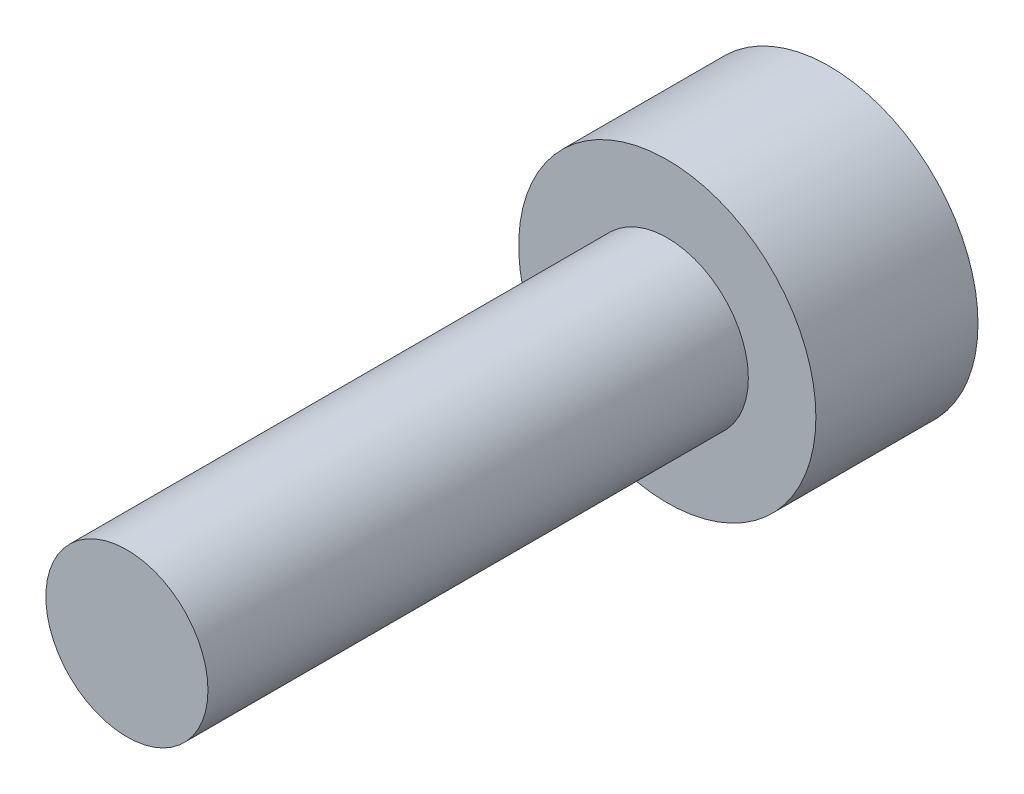
ISO-10303-21;
HEADER;
FILE_DESCRIPTION(('STEP AP214'),'2;1');
FILE_NAME('part.step','',(''),(''),'','','');
FILE_SCHEMA(('AUTOMOTIVE_DESIGN { 1 0 10303 214 1 1 1 1 }'));
ENDSEC;
DATA;
#1=APPLICATION_CONTEXT('core data for automotive mechanical design processes');
#2=APPLICATION_PROTOCOL_DEFINITION('international standard','automotive_design',2000,#1);
#3=PRODUCT_CONTEXT('',#1,'mechanical');
#4=PRODUCT('Part','Part','',(#3));
#5=PRODUCT_RELATED_PRODUCT_CATEGORY('part','',(#4));
#6=PRODUCT_DEFINITION_FORMATION('','',#4);
#7=PRODUCT_DEFINITION_CONTEXT('part definition',#1,'design');
#8=PRODUCT_DEFINITION('design','',#6,#7);
#9=PRODUCT_DEFINITION_SHAPE('','',#8);
#10=(LENGTH_UNIT() NAMED_UNIT(*) SI_UNIT(.MILLI.,.METRE.));
#11=(NAMED_UNIT(*) PLANE_ANGLE_UNIT() SI_UNIT($,.RADIAN.));
#12=(NAMED_UNIT(*) SI_UNIT($,.STERADIAN.) SOLID_ANGLE_UNIT());
#13=UNCERTAINTY_MEASURE_WITH_UNIT(LENGTH_MEASURE(1.E-05),#10,'distance_accuracy_value','');
#14=(GEOMETRIC_REPRESENTATION_CONTEXT(3) GLOBAL_UNCERTAINTY_ASSIGNED_CONTEXT((#13)) GLOBAL_UNIT_ASSIGNED_CONTEXT((#10,
#11,#12)) REPRESENTATION_CONTEXT('',''));
#15=CARTESIAN_POINT('',(0.,0.,0.));
#16=DIRECTION('',(0.,0.,1.));
#17=DIRECTION('',(1.,0.,0.));
#18=AXIS2_PLACEMENT_3D('',#15,#16,#17);
#19=CARTESIAN_POINT('',(0.,0.,-3.));
#20=DIRECTION('',(0.,0.,1.));
#21=DIRECTION('',(1.,0.,0.));
#22=AXIS2_PLACEMENT_3D('',#19,#20,#21);
#23=PLANE('',#22);
#24=CARTESIAN_POINT('',(0.,0.,-3.));
#25=DIRECTION('',(0.,0.,1.));
#26=DIRECTION('',(1.,0.,0.));
#27=AXIS2_PLACEMENT_3D('',#24,#25,#26);
#28=CIRCLE('',#27,2.75);
#29=CARTESIAN_POINT('',(2.75,0.,-3.));
#30=VERTEX_POINT('',#29);
#31=EDGE_CURVE('E50',#30,#30,#28,.T.);
#32=ORIENTED_EDGE('',*,*,#31,.F.);
#33=EDGE_LOOP('',(#32));
#34=FACE_BOUND('',#33,.T.);
#35=DIRECTION('',(0.866025403784441,-0.499999999999995,0.));
#36=VECTOR('',#35,1.);
#37=CARTESIAN_POINT('',(-1.24999999999999,-0.721687836487047,-3.));
#38=LINE('',#37,#36);
#39=CARTESIAN_POINT('',(-1.24999999999999,-0.721687836487047,-3.));
#40=VERTEX_POINT('',#39);
#41=CARTESIAN_POINT('',(0.,-1.44337567297406,-3.));
#42=VERTEX_POINT('',#41);
#43=EDGE_CURVE('E64',#40,#42,#38,.T.);
#44=ORIENTED_EDGE('',*,*,#43,.T.);
#45=DIRECTION('',(0.866025403784438,0.500000000000001,0.));
#46=VECTOR('',#45,1.);
#47=CARTESIAN_POINT('',(0.,-1.44337567297406,-3.));
#48=LINE('',#47,#46);
#49=CARTESIAN_POINT('',(1.25,-0.721687836487029,-3.));
#50=VERTEX_POINT('',#49);
#51=EDGE_CURVE('E137',#42,#50,#48,.T.);
#52=ORIENTED_EDGE('',*,*,#51,.T.);
#53=DIRECTION('',(0.,1.,0.));
#54=VECTOR('',#53,1.);
#55=CARTESIAN_POINT('',(1.25,-0.721687836487029,-3.));
#56=LINE('',#55,#54);
#57=CARTESIAN_POINT('',(1.25,0.721687836487038,-3.));
#58=VERTEX_POINT('',#57);
#59=EDGE_CURVE('E141',#50,#58,#56,.T.);
#60=ORIENTED_EDGE('',*,*,#59,.T.);
#61=DIRECTION('',(-0.866025403784442,0.499999999999995,0.));
#62=VECTOR('',#61,1.);
#63=CARTESIAN_POINT('',(1.25,0.721687836487038,-3.));
#64=LINE('',#63,#62);
#65=CARTESIAN_POINT('',(0.,1.44337567297406,-3.));
#66=VERTEX_POINT('',#65);
#67=EDGE_CURVE('E146',#58,#66,#64,.T.);
#68=ORIENTED_EDGE('',*,*,#67,.T.);
#69=DIRECTION('',(-0.866025403784434,-0.500000000000007,0.));
#70=VECTOR('',#69,1.);
#71=CARTESIAN_POINT('',(0.,1.44337567297406,-3.));
#72=LINE('',#71,#70);
#73=CARTESIAN_POINT('',(-1.25000000000001,0.721687836487021,-3.));
#74=VERTEX_POINT('',#73);
#75=EDGE_CURVE('E124',#66,#74,#72,.T.);
#76=ORIENTED_EDGE('',*,*,#75,.T.);
#77=DIRECTION('',(0.,-1.,0.));
#78=VECTOR('',#77,1.);
#79=CARTESIAN_POINT('',(-1.25000000000001,0.721687836487021,-3.));
#80=LINE('',#79,#78);
#81=EDGE_CURVE('E152',#74,#40,#80,.T.);
#82=ORIENTED_EDGE('',*,*,#81,.T.);
#83=EDGE_LOOP('',(#44,#52,#60,#68,#76,#82));
#84=FACE_BOUND('',#83,.T.);
#85=ADVANCED_FACE('F43',(#34,#84),#23,.F.);
#86=CARTESIAN_POINT('',(0.,0.,0.));
#87=DIRECTION('',(0.,0.,-1.));
#88=DIRECTION('',(-1.,0.,0.));
#89=AXIS2_PLACEMENT_3D('',#86,#87,#88);
#90=CYLINDRICAL_SURFACE('',#89,2.75);
#91=CARTESIAN_POINT('',(0.,0.,0.));
#92=DIRECTION('',(0.,0.,1.));
#93=DIRECTION('',(1.,0.,0.));
#94=AXIS2_PLACEMENT_3D('',#91,#92,#93);
#95=CIRCLE('',#94,2.75);
#96=CARTESIAN_POINT('',(2.75,0.,0.));
#97=VERTEX_POINT('',#96);
#98=EDGE_CURVE('E52',#97,#97,#95,.T.);
#99=ORIENTED_EDGE('',*,*,#98,.F.);
#100=EDGE_LOOP('',(#99));
#101=FACE_BOUND('',#100,.T.);
#102=ORIENTED_EDGE('',*,*,#31,.T.);
#103=EDGE_LOOP('',(#102));
#104=FACE_BOUND('',#103,.T.);
#105=ADVANCED_FACE('F44',(#101,#104),#90,.T.);
#106=CARTESIAN_POINT('',(0.,0.,0.));
#107=DIRECTION('',(0.,0.,1.));
#108=DIRECTION('',(1.,0.,0.));
#109=AXIS2_PLACEMENT_3D('',#106,#107,#108);
#110=PLANE('',#109);
#111=CARTESIAN_POINT('',(0.,0.,0.));
#112=DIRECTION('',(0.,0.,1.));
#113=DIRECTION('',(1.,0.,0.));
#114=AXIS2_PLACEMENT_3D('',#111,#112,#113);
#115=CIRCLE('',#114,1.5);
#116=CARTESIAN_POINT('',(1.5,0.,0.));
#117=VERTEX_POINT('',#116);
#118=EDGE_CURVE('E11',#117,#117,#115,.T.);
#119=ORIENTED_EDGE('',*,*,#118,.F.);
#120=EDGE_LOOP('',(#119));
#121=FACE_BOUND('',#120,.T.);
#122=ORIENTED_EDGE('',*,*,#98,.T.);
#123=EDGE_LOOP('',(#122));
#124=FACE_BOUND('',#123,.T.);
#125=ADVANCED_FACE('F214',(#121,#124),#110,.T.);
#126=CARTESIAN_POINT('',(0.,0.,10.));
#127=DIRECTION('',(0.,0.,-1.));
#128=DIRECTION('',(-1.,0.,0.));
#129=AXIS2_PLACEMENT_3D('',#126,#127,#128);
#130=CYLINDRICAL_SURFACE('',#129,1.5);
#131=CARTESIAN_POINT('',(0.,0.,10.));
#132=DIRECTION('',(0.,0.,1.));
#133=DIRECTION('',(1.,0.,0.));
#134=AXIS2_PLACEMENT_3D('',#131,#132,#133);
#135=CIRCLE('',#134,1.5);
#136=CARTESIAN_POINT('',(1.5,0.,10.));
#137=VERTEX_POINT('',#136);
#138=EDGE_CURVE('E169',#137,#137,#135,.T.);
#139=ORIENTED_EDGE('',*,*,#138,.F.);
#140=EDGE_LOOP('',(#139));
#141=FACE_BOUND('',#140,.T.);
#142=ORIENTED_EDGE('',*,*,#118,.T.);
#143=EDGE_LOOP('',(#142));
#144=FACE_BOUND('',#143,.T.);
#145=ADVANCED_FACE('F210',(#141,#144),#130,.T.);
#146=CARTESIAN_POINT('',(0.,0.,10.));
#147=DIRECTION('',(0.,0.,1.));
#148=DIRECTION('',(1.,0.,0.));
#149=AXIS2_PLACEMENT_3D('',#146,#147,#148);
#150=PLANE('',#149);
#151=ORIENTED_EDGE('',*,*,#138,.T.);
#152=EDGE_LOOP('',(#151));
#153=FACE_BOUND('',#152,.T.);
#154=ADVANCED_FACE('F201',(#153),#150,.T.);
#155=CARTESIAN_POINT('',(-1.24999999999999,-0.721687836487047,-1.5));
#156=DIRECTION('',(0.499999999999995,0.866025403784441,0.));
#157=DIRECTION('',(-0.866025403784442,0.499999999999995,0.));
#158=AXIS2_PLACEMENT_3D('',#155,#156,#157);
#159=PLANE('',#158);
#160=ORIENTED_EDGE('',*,*,#43,.F.);
#161=DIRECTION('',(0.,0.,-1.));
#162=VECTOR('',#161,1.);
#163=CARTESIAN_POINT('',(-1.24999999999999,-0.721687836487047,-1.5));
#164=LINE('',#163,#162);
#165=CARTESIAN_POINT('',(-1.24999999999999,-0.721687836487047,-1.5));
#166=VERTEX_POINT('',#165);
#167=EDGE_CURVE('E134',#166,#40,#164,.T.);
#168=ORIENTED_EDGE('',*,*,#167,.F.);
#169=DIRECTION('',(0.866025403784441,-0.499999999999995,0.));
#170=VECTOR('',#169,1.);
#171=CARTESIAN_POINT('',(-1.24999999999999,-0.721687836487047,-1.5));
#172=LINE('',#171,#170);
#173=CARTESIAN_POINT('',(0.,-1.44337567297406,-1.5));
#174=VERTEX_POINT('',#173);
#175=EDGE_CURVE('E156',#166,#174,#172,.T.);
#176=ORIENTED_EDGE('',*,*,#175,.T.);
#177=DIRECTION('',(0.,0.,-1.));
#178=VECTOR('',#177,1.);
#179=CARTESIAN_POINT('',(0.,-1.44337567297406,-1.5));
#180=LINE('',#179,#178);
#181=EDGE_CURVE('E168',#174,#42,#180,.T.);
#182=ORIENTED_EDGE('',*,*,#181,.T.);
#183=EDGE_LOOP('',(#160,#168,#176,#182));
#184=FACE_BOUND('',#183,.T.);
#185=ADVANCED_FACE('F183',(#184),#159,.T.);
#186=CARTESIAN_POINT('',(0.,-1.44337567297406,-1.5));
#187=DIRECTION('',(-0.500000000000001,0.866025403784438,0.));
#188=DIRECTION('',(-0.866025403784438,-0.500000000000001,0.));
#189=AXIS2_PLACEMENT_3D('',#186,#187,#188);
#190=PLANE('',#189);
#191=ORIENTED_EDGE('',*,*,#51,.F.);
#192=ORIENTED_EDGE('',*,*,#181,.F.);
#193=DIRECTION('',(0.866025403784438,0.500000000000001,0.));
#194=VECTOR('',#193,1.);
#195=CARTESIAN_POINT('',(0.,-1.44337567297406,-1.5));
#196=LINE('',#195,#194);
#197=CARTESIAN_POINT('',(1.25,-0.721687836487029,-1.5));
#198=VERTEX_POINT('',#197);
#199=EDGE_CURVE('E99',#174,#198,#196,.T.);
#200=ORIENTED_EDGE('',*,*,#199,.T.);
#201=DIRECTION('',(0.,0.,-1.));
#202=VECTOR('',#201,1.);
#203=CARTESIAN_POINT('',(1.25,-0.721687836487029,-1.5));
#204=LINE('',#203,#202);
#205=EDGE_CURVE('E161',#198,#50,#204,.T.);
#206=ORIENTED_EDGE('',*,*,#205,.T.);
#207=EDGE_LOOP('',(#191,#192,#200,#206));
#208=FACE_BOUND('',#207,.T.);
#209=ADVANCED_FACE('F193',(#208),#190,.T.);
#210=CARTESIAN_POINT('',(1.25,-0.721687836487029,-1.5));
#211=DIRECTION('',(-1.,0.,0.));
#212=DIRECTION('',(0.,-1.,0.));
#213=AXIS2_PLACEMENT_3D('',#210,#211,#212);
#214=PLANE('',#213);
#215=ORIENTED_EDGE('',*,*,#59,.F.);
#216=ORIENTED_EDGE('',*,*,#205,.F.);
#217=DIRECTION('',(0.,1.,0.));
#218=VECTOR('',#217,1.);
#219=CARTESIAN_POINT('',(1.25,-0.721687836487029,-1.5));
#220=LINE('',#219,#218);
#221=CARTESIAN_POINT('',(1.25,0.721687836487038,-1.5));
#222=VERTEX_POINT('',#221);
#223=EDGE_CURVE('E118',#198,#222,#220,.T.);
#224=ORIENTED_EDGE('',*,*,#223,.T.);
#225=DIRECTION('',(0.,0.,-1.));
#226=VECTOR('',#225,1.);
#227=CARTESIAN_POINT('',(1.25,0.721687836487038,-1.5));
#228=LINE('',#227,#226);
#229=EDGE_CURVE('E114',#222,#58,#228,.T.);
#230=ORIENTED_EDGE('',*,*,#229,.T.);
#231=EDGE_LOOP('',(#215,#216,#224,#230));
#232=FACE_BOUND('',#231,.T.);
#233=ADVANCED_FACE('F191',(#232),#214,.T.);
#234=CARTESIAN_POINT('',(1.25,0.721687836487038,-1.5));
#235=DIRECTION('',(-0.499999999999995,-0.866025403784441,0.));
#236=DIRECTION('',(0.866025403784442,-0.499999999999995,0.));
#237=AXIS2_PLACEMENT_3D('',#234,#235,#236);
#238=PLANE('',#237);
#239=ORIENTED_EDGE('',*,*,#67,.F.);
#240=ORIENTED_EDGE('',*,*,#229,.F.);
#241=DIRECTION('',(-0.866025403784442,0.499999999999995,0.));
#242=VECTOR('',#241,1.);
#243=CARTESIAN_POINT('',(1.25,0.721687836487038,-1.5));
#244=LINE('',#243,#242);
#245=CARTESIAN_POINT('',(0.,1.44337567297406,-1.5));
#246=VERTEX_POINT('',#245);
#247=EDGE_CURVE('E109',#222,#246,#244,.T.);
#248=ORIENTED_EDGE('',*,*,#247,.T.);
#249=DIRECTION('',(0.,0.,-1.));
#250=VECTOR('',#249,1.);
#251=CARTESIAN_POINT('',(0.,1.44337567297406,-1.5));
#252=LINE('',#251,#250);
#253=EDGE_CURVE('E112',#246,#66,#252,.T.);
#254=ORIENTED_EDGE('',*,*,#253,.T.);
#255=EDGE_LOOP('',(#239,#240,#248,#254));
#256=FACE_BOUND('',#255,.T.);
#257=ADVANCED_FACE('F113',(#256),#238,.T.);
#258=CARTESIAN_POINT('',(0.,1.44337567297406,-1.5));
#259=DIRECTION('',(0.500000000000007,-0.866025403784435,0.));
#260=DIRECTION('',(0.866025403784434,0.500000000000007,0.));
#261=AXIS2_PLACEMENT_3D('',#258,#259,#260);
#262=PLANE('',#261);
#263=ORIENTED_EDGE('',*,*,#75,.F.);
#264=ORIENTED_EDGE('',*,*,#253,.F.);
#265=DIRECTION('',(-0.866025403784434,-0.500000000000007,0.));
#266=VECTOR('',#265,1.);
#267=CARTESIAN_POINT('',(0.,1.44337567297406,-1.5));
#268=LINE('',#267,#266);
#269=CARTESIAN_POINT('',(-1.25000000000001,0.721687836487021,-1.5));
#270=VERTEX_POINT('',#269);
#271=EDGE_CURVE('E117',#246,#270,#268,.T.);
#272=ORIENTED_EDGE('',*,*,#271,.T.);
#273=DIRECTION('',(0.,0.,-1.));
#274=VECTOR('',#273,1.);
#275=CARTESIAN_POINT('',(-1.25000000000001,0.721687836487021,-1.5));
#276=LINE('',#275,#274);
#277=EDGE_CURVE('E91',#270,#74,#276,.T.);
#278=ORIENTED_EDGE('',*,*,#277,.T.);
#279=EDGE_LOOP('',(#263,#264,#272,#278));
#280=FACE_BOUND('',#279,.T.);
#281=ADVANCED_FACE('F122',(#280),#262,.T.);
#282=CARTESIAN_POINT('',(-1.25000000000001,0.721687836487021,-1.5));
#283=DIRECTION('',(1.,0.,0.));
#284=DIRECTION('',(0.,1.,0.));
#285=AXIS2_PLACEMENT_3D('',#282,#283,#284);
#286=PLANE('',#285);
#287=ORIENTED_EDGE('',*,*,#81,.F.);
#288=ORIENTED_EDGE('',*,*,#277,.F.);
#289=DIRECTION('',(0.,-1.,0.));
#290=VECTOR('',#289,1.);
#291=CARTESIAN_POINT('',(-1.25000000000001,0.721687836487021,-1.5));
#292=LINE('',#291,#290);
#293=EDGE_CURVE('E68',#270,#166,#292,.T.);
#294=ORIENTED_EDGE('',*,*,#293,.T.);
#295=ORIENTED_EDGE('',*,*,#167,.T.);
#296=EDGE_LOOP('',(#287,#288,#294,#295));
#297=FACE_BOUND('',#296,.T.);
#298=ADVANCED_FACE('F182',(#297),#286,.T.);
#299=CARTESIAN_POINT('',(0.,0.,-1.5));
#300=DIRECTION('',(0.,0.,1.));
#301=DIRECTION('',(1.,0.,0.));
#302=AXIS2_PLACEMENT_3D('',#299,#300,#301);
#303=PLANE('',#302);
#304=ORIENTED_EDGE('',*,*,#175,.F.);
#305=ORIENTED_EDGE('',*,*,#293,.F.);
#306=ORIENTED_EDGE('',*,*,#271,.F.);
#307=ORIENTED_EDGE('',*,*,#247,.F.);
#308=ORIENTED_EDGE('',*,*,#223,.F.);
#309=ORIENTED_EDGE('',*,*,#199,.F.);
#310=EDGE_LOOP('',(#304,#305,#306,#307,#308,#309));
#311=FACE_BOUND('',#310,.T.);
#312=ADVANCED_FACE('F126',(#311),#303,.F.);
#313=CLOSED_SHELL('',(#85,#105,#125,#145,#154,#185,#209,#233,#257,#281,#298,#312));
#314=MANIFOLD_SOLID_BREP('B2',#313);
#315=ADVANCED_BREP_SHAPE_REPRESENTATION('',(#18,#314),#14);
#316=SHAPE_DEFINITION_REPRESENTATION(#9,#315);
ENDSEC;
END-ISO-10303-21;
